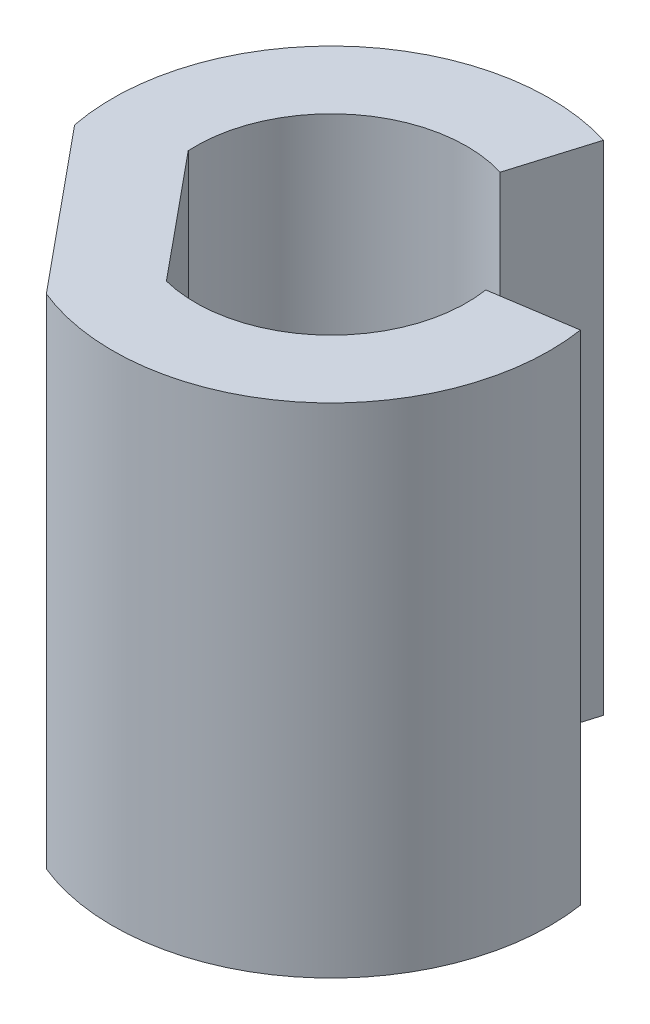
ISO-10303-21;
HEADER;
FILE_DESCRIPTION(('STEP AP214'),'2;1');
FILE_NAME('part.step','',(''),(''),'','','');
FILE_SCHEMA(('AUTOMOTIVE_DESIGN { 1 0 10303 214 1 1 1 1 }'));
ENDSEC;
DATA;
#1=APPLICATION_CONTEXT('core data for automotive mechanical design processes');
#2=APPLICATION_PROTOCOL_DEFINITION('international standard','automotive_design',2000,#1);
#3=PRODUCT_CONTEXT('',#1,'mechanical');
#4=PRODUCT('Part','Part','',(#3));
#5=PRODUCT_RELATED_PRODUCT_CATEGORY('part','',(#4));
#6=PRODUCT_DEFINITION_FORMATION('','',#4);
#7=PRODUCT_DEFINITION_CONTEXT('part definition',#1,'design');
#8=PRODUCT_DEFINITION('design','',#6,#7);
#9=PRODUCT_DEFINITION_SHAPE('','',#8);
#10=(LENGTH_UNIT() NAMED_UNIT(*) SI_UNIT(.MILLI.,.METRE.));
#11=(NAMED_UNIT(*) PLANE_ANGLE_UNIT() SI_UNIT($,.RADIAN.));
#12=(NAMED_UNIT(*) SI_UNIT($,.STERADIAN.) SOLID_ANGLE_UNIT());
#13=UNCERTAINTY_MEASURE_WITH_UNIT(LENGTH_MEASURE(1.E-05),#10,'distance_accuracy_value','');
#14=(GEOMETRIC_REPRESENTATION_CONTEXT(3) GLOBAL_UNCERTAINTY_ASSIGNED_CONTEXT((#13)) GLOBAL_UNIT_ASSIGNED_CONTEXT((#10,
#11,#12)) REPRESENTATION_CONTEXT('',''));
#15=CARTESIAN_POINT('',(0.,0.,0.));
#16=DIRECTION('',(0.,0.,1.));
#17=DIRECTION('',(1.,0.,0.));
#18=AXIS2_PLACEMENT_3D('',#15,#16,#17);
#19=CARTESIAN_POINT('',(0.,9.,0.));
#20=DIRECTION('',(0.,-1.,0.));
#21=DIRECTION('',(0.,0.,-1.));
#22=AXIS2_PLACEMENT_3D('',#19,#20,#21);
#23=CYLINDRICAL_SURFACE('',#22,2.45);
#24=CARTESIAN_POINT('',(0.,0.,0.));
#25=DIRECTION('',(0.,-1.,0.));
#26=DIRECTION('',(0.,0.,1.));
#27=AXIS2_PLACEMENT_3D('',#24,#25,#26);
#28=CIRCLE('',#27,2.45);
#29=CARTESIAN_POINT('',(2.42155894628891,0.,-0.37222610017051));
#30=VERTEX_POINT('',#29);
#31=CARTESIAN_POINT('',(-0.602474399543159,0.,2.37476832509934));
#32=VERTEX_POINT('',#31);
#33=EDGE_CURVE('E131',#30,#32,#28,.T.);
#34=ORIENTED_EDGE('',*,*,#33,.T.);
#35=DIRECTION('',(0.,-1.,0.));
#36=VECTOR('',#35,1.);
#37=CARTESIAN_POINT('',(-0.602474399543159,9.,2.37476832509934));
#38=LINE('',#37,#36);
#39=CARTESIAN_POINT('',(-0.602474399543159,9.,2.37476832509934));
#40=VERTEX_POINT('',#39);
#41=EDGE_CURVE('E11',#40,#32,#38,.T.);
#42=ORIENTED_EDGE('',*,*,#41,.F.);
#43=CARTESIAN_POINT('',(0.,9.,0.));
#44=DIRECTION('',(0.,-1.,0.));
#45=DIRECTION('',(0.,0.,1.));
#46=AXIS2_PLACEMENT_3D('',#43,#44,#45);
#47=CIRCLE('',#46,2.45);
#48=CARTESIAN_POINT('',(2.42155894628891,9.,-0.37222610017051));
#49=VERTEX_POINT('',#48);
#50=EDGE_CURVE('E145',#49,#40,#47,.T.);
#51=ORIENTED_EDGE('',*,*,#50,.F.);
#52=DIRECTION('',(0.,-1.,0.));
#53=VECTOR('',#52,1.);
#54=CARTESIAN_POINT('',(2.42155894628891,9.,-0.37222610017051));
#55=LINE('',#54,#53);
#56=EDGE_CURVE('E127',#49,#30,#55,.T.);
#57=ORIENTED_EDGE('',*,*,#56,.T.);
#58=EDGE_LOOP('',(#34,#42,#51,#57));
#59=FACE_BOUND('',#58,.T.);
#60=ADVANCED_FACE('F35',(#59),#23,.F.);
#61=CARTESIAN_POINT('',(-0.602474399543159,9.,2.37476832509934));
#62=DIRECTION('',(-0.771879330020003,0.,0.63576906175739));
#63=DIRECTION('',(0.63576906175739,0.,0.771879330020003));
#64=AXIS2_PLACEMENT_3D('',#61,#62,#63);
#65=PLANE('',#64);
#66=DIRECTION('',(-0.63576906175739,0.,-0.771879330020003));
#67=VECTOR('',#66,1.);
#68=CARTESIAN_POINT('',(-0.602474399543159,0.,2.37476832509934));
#69=LINE('',#68,#67);
#70=CARTESIAN_POINT('',(-2.44620467863959,0.,0.136318268041329));
#71=VERTEX_POINT('',#70);
#72=EDGE_CURVE('E134',#32,#71,#69,.T.);
#73=ORIENTED_EDGE('',*,*,#72,.T.);
#74=DIRECTION('',(0.,-1.,0.));
#75=VECTOR('',#74,1.);
#76=CARTESIAN_POINT('',(-2.44620467863959,9.,0.136318268041329));
#77=LINE('',#76,#75);
#78=CARTESIAN_POINT('',(-2.44620467863959,9.,0.136318268041329));
#79=VERTEX_POINT('',#78);
#80=EDGE_CURVE('E43',#79,#71,#77,.T.);
#81=ORIENTED_EDGE('',*,*,#80,.F.);
#82=DIRECTION('',(-0.63576906175739,0.,-0.771879330020003));
#83=VECTOR('',#82,1.);
#84=CARTESIAN_POINT('',(-0.602474399543159,9.,2.37476832509934));
#85=LINE('',#84,#83);
#86=EDGE_CURVE('E94',#40,#79,#85,.T.);
#87=ORIENTED_EDGE('',*,*,#86,.F.);
#88=ORIENTED_EDGE('',*,*,#41,.T.);
#89=EDGE_LOOP('',(#73,#81,#87,#88));
#90=FACE_BOUND('',#89,.T.);
#91=ADVANCED_FACE('F180',(#90),#65,.F.);
#92=CARTESIAN_POINT('',(0.,9.,0.));
#93=DIRECTION('',(0.,-1.,0.));
#94=DIRECTION('',(0.,0.,-1.));
#95=AXIS2_PLACEMENT_3D('',#92,#93,#94);
#96=CYLINDRICAL_SURFACE('',#95,2.45);
#97=CARTESIAN_POINT('',(0.,0.,0.));
#98=DIRECTION('',(0.,-1.,0.));
#99=DIRECTION('',(0.,0.,-1.));
#100=AXIS2_PLACEMENT_3D('',#97,#98,#99);
#101=CIRCLE('',#100,2.45);
#102=CARTESIAN_POINT('',(0.708554004235491,0.,-2.34530407902298));
#103=VERTEX_POINT('',#102);
#104=EDGE_CURVE('E136',#71,#103,#101,.T.);
#105=ORIENTED_EDGE('',*,*,#104,.T.);
#106=DIRECTION('',(0.,-1.,0.));
#107=VECTOR('',#106,1.);
#108=CARTESIAN_POINT('',(0.708554004235491,9.,-2.34530407902298));
#109=LINE('',#108,#107);
#110=CARTESIAN_POINT('',(0.708554004235491,9.,-2.34530407902298));
#111=VERTEX_POINT('',#110);
#112=EDGE_CURVE('E152',#111,#103,#109,.T.);
#113=ORIENTED_EDGE('',*,*,#112,.F.);
#114=CARTESIAN_POINT('',(0.,9.,0.));
#115=DIRECTION('',(0.,-1.,0.));
#116=DIRECTION('',(0.,0.,-1.));
#117=AXIS2_PLACEMENT_3D('',#114,#115,#116);
#118=CIRCLE('',#117,2.45);
#119=EDGE_CURVE('E160',#79,#111,#118,.T.);
#120=ORIENTED_EDGE('',*,*,#119,.F.);
#121=ORIENTED_EDGE('',*,*,#80,.T.);
#122=EDGE_LOOP('',(#105,#113,#120,#121));
#123=FACE_BOUND('',#122,.T.);
#124=ADVANCED_FACE('F158',(#123),#96,.F.);
#125=CARTESIAN_POINT('',(1.14236257825722,9.,-3.78120453556767));
#126=DIRECTION('',(-0.95726697102979,0.,-0.289205716014486));
#127=DIRECTION('',(-0.289205716014486,0.,0.95726697102979));
#128=AXIS2_PLACEMENT_3D('',#125,#126,#127);
#129=PLANE('',#128);
#130=DIRECTION('',(0.289205716014486,0.,-0.95726697102979));
#131=VECTOR('',#130,1.);
#132=CARTESIAN_POINT('',(1.14236257825722,0.,-3.78120453556767));
#133=LINE('',#132,#131);
#134=CARTESIAN_POINT('',(1.14236257825722,0.,-3.78120453556767));
#135=VERTEX_POINT('',#134);
#136=EDGE_CURVE('E138',#103,#135,#133,.T.);
#137=ORIENTED_EDGE('',*,*,#136,.T.);
#138=DIRECTION('',(0.,-1.,0.));
#139=VECTOR('',#138,1.);
#140=CARTESIAN_POINT('',(1.14236257825722,9.,-3.78120453556767));
#141=LINE('',#140,#139);
#142=CARTESIAN_POINT('',(1.14236257825722,9.,-3.78120453556767));
#143=VERTEX_POINT('',#142);
#144=EDGE_CURVE('E149',#143,#135,#141,.T.);
#145=ORIENTED_EDGE('',*,*,#144,.F.);
#146=DIRECTION('',(0.289205716014486,0.,-0.95726697102979));
#147=VECTOR('',#146,1.);
#148=CARTESIAN_POINT('',(1.14236257825722,9.,-3.78120453556767));
#149=LINE('',#148,#147);
#150=EDGE_CURVE('E172',#111,#143,#149,.T.);
#151=ORIENTED_EDGE('',*,*,#150,.F.);
#152=ORIENTED_EDGE('',*,*,#112,.T.);
#153=EDGE_LOOP('',(#137,#145,#151,#152));
#154=FACE_BOUND('',#153,.T.);
#155=ADVANCED_FACE('F168',(#154),#129,.F.);
#156=CARTESIAN_POINT('',(0.,9.,0.));
#157=DIRECTION('',(0.,-1.,0.));
#158=DIRECTION('',(0.,0.,-1.));
#159=AXIS2_PLACEMENT_3D('',#156,#157,#158);
#160=CYLINDRICAL_SURFACE('',#159,3.95);
#161=CARTESIAN_POINT('',(0.,0.,0.));
#162=DIRECTION('',(0.,1.,0.));
#163=DIRECTION('',(0.,0.,-1.));
#164=AXIS2_PLACEMENT_3D('',#161,#162,#163);
#165=CIRCLE('',#164,3.95);
#166=CARTESIAN_POINT('',(-3.87631743842231,0.,0.759383379185442));
#167=VERTEX_POINT('',#166);
#168=EDGE_CURVE('E140',#135,#167,#165,.T.);
#169=ORIENTED_EDGE('',*,*,#168,.T.);
#170=DIRECTION('',(0.,-1.,0.));
#171=VECTOR('',#170,1.);
#172=CARTESIAN_POINT('',(-3.87631743842231,9.,0.759383379185442));
#173=LINE('',#172,#171);
#174=CARTESIAN_POINT('',(-3.87631743842231,9.,0.759383379185442));
#175=VERTEX_POINT('',#174);
#176=EDGE_CURVE('E122',#175,#167,#173,.T.);
#177=ORIENTED_EDGE('',*,*,#176,.F.);
#178=CARTESIAN_POINT('',(0.,9.,0.));
#179=DIRECTION('',(0.,1.,0.));
#180=DIRECTION('',(0.,0.,-1.));
#181=AXIS2_PLACEMENT_3D('',#178,#179,#180);
#182=CIRCLE('',#181,3.95);
#183=EDGE_CURVE('E113',#143,#175,#182,.T.);
#184=ORIENTED_EDGE('',*,*,#183,.F.);
#185=ORIENTED_EDGE('',*,*,#144,.T.);
#186=EDGE_LOOP('',(#169,#177,#184,#185));
#187=FACE_BOUND('',#186,.T.);
#188=ADVANCED_FACE('F171',(#187),#160,.T.);
#189=CARTESIAN_POINT('',(-1.48799962982044,9.,3.6590103992274));
#190=DIRECTION('',(0.771879330020003,0.,-0.63576906175739));
#191=DIRECTION('',(-0.63576906175739,0.,-0.771879330020003));
#192=AXIS2_PLACEMENT_3D('',#189,#190,#191);
#193=PLANE('',#192);
#194=DIRECTION('',(0.63576906175739,0.,0.771879330020003));
#195=VECTOR('',#194,1.);
#196=CARTESIAN_POINT('',(-1.48799962982044,0.,3.6590103992274));
#197=LINE('',#196,#195);
#198=CARTESIAN_POINT('',(-1.48799962982044,0.,3.6590103992274));
#199=VERTEX_POINT('',#198);
#200=EDGE_CURVE('E121',#167,#199,#197,.T.);
#201=ORIENTED_EDGE('',*,*,#200,.T.);
#202=DIRECTION('',(0.,-1.,0.));
#203=VECTOR('',#202,1.);
#204=CARTESIAN_POINT('',(-1.48799962982044,9.,3.6590103992274));
#205=LINE('',#204,#203);
#206=CARTESIAN_POINT('',(-1.48799962982044,9.,3.6590103992274));
#207=VERTEX_POINT('',#206);
#208=EDGE_CURVE('E118',#207,#199,#205,.T.);
#209=ORIENTED_EDGE('',*,*,#208,.F.);
#210=DIRECTION('',(0.63576906175739,0.,0.771879330020003));
#211=VECTOR('',#210,1.);
#212=CARTESIAN_POINT('',(-1.48799962982044,9.,3.6590103992274));
#213=LINE('',#212,#211);
#214=EDGE_CURVE('E107',#175,#207,#213,.T.);
#215=ORIENTED_EDGE('',*,*,#214,.F.);
#216=ORIENTED_EDGE('',*,*,#176,.T.);
#217=EDGE_LOOP('',(#201,#209,#215,#216));
#218=FACE_BOUND('',#217,.T.);
#219=ADVANCED_FACE('F119',(#218),#193,.F.);
#220=CARTESIAN_POINT('',(0.,9.,0.));
#221=DIRECTION('',(0.,-1.,0.));
#222=DIRECTION('',(0.,0.,-1.));
#223=AXIS2_PLACEMENT_3D('',#220,#221,#222);
#224=CYLINDRICAL_SURFACE('',#223,3.95);
#225=CARTESIAN_POINT('',(0.,0.,0.));
#226=DIRECTION('',(0.,1.,0.));
#227=DIRECTION('',(0.,0.,1.));
#228=AXIS2_PLACEMENT_3D('',#225,#226,#227);
#229=CIRCLE('',#228,3.95);
#230=CARTESIAN_POINT('',(3.90414605626171,0.,-0.600119630887148));
#231=VERTEX_POINT('',#230);
#232=EDGE_CURVE('E80',#199,#231,#229,.T.);
#233=ORIENTED_EDGE('',*,*,#232,.T.);
#234=DIRECTION('',(0.,-1.,0.));
#235=VECTOR('',#234,1.);
#236=CARTESIAN_POINT('',(3.90414605626171,9.,-0.600119630887148));
#237=LINE('',#236,#235);
#238=CARTESIAN_POINT('',(3.90414605626171,9.,-0.600119630887148));
#239=VERTEX_POINT('',#238);
#240=EDGE_CURVE('E123',#239,#231,#237,.T.);
#241=ORIENTED_EDGE('',*,*,#240,.F.);
#242=CARTESIAN_POINT('',(0.,9.,0.));
#243=DIRECTION('',(0.,1.,0.));
#244=DIRECTION('',(0.,0.,1.));
#245=AXIS2_PLACEMENT_3D('',#242,#243,#244);
#246=CIRCLE('',#245,3.95);
#247=EDGE_CURVE('E111',#207,#239,#246,.T.);
#248=ORIENTED_EDGE('',*,*,#247,.F.);
#249=ORIENTED_EDGE('',*,*,#208,.T.);
#250=EDGE_LOOP('',(#233,#241,#248,#249));
#251=FACE_BOUND('',#250,.T.);
#252=ADVANCED_FACE('F125',(#251),#224,.T.);
#253=CARTESIAN_POINT('',(2.42155894628891,9.,-0.37222610017051));
#254=DIRECTION('',(0.151929020477759,0.,0.988391406648535));
#255=DIRECTION('',(0.988391406648535,0.,-0.151929020477759));
#256=AXIS2_PLACEMENT_3D('',#253,#254,#255);
#257=PLANE('',#256);
#258=DIRECTION('',(-0.988391406648534,0.,0.151929020477758));
#259=VECTOR('',#258,1.);
#260=CARTESIAN_POINT('',(2.42155894628891,0.,-0.37222610017051));
#261=LINE('',#260,#259);
#262=EDGE_CURVE('E86',#231,#30,#261,.T.);
#263=ORIENTED_EDGE('',*,*,#262,.T.);
#264=ORIENTED_EDGE('',*,*,#56,.F.);
#265=DIRECTION('',(-0.988391406648534,0.,0.151929020477758));
#266=VECTOR('',#265,1.);
#267=CARTESIAN_POINT('',(2.42155894628891,9.,-0.37222610017051));
#268=LINE('',#267,#266);
#269=EDGE_CURVE('E51',#239,#49,#268,.T.);
#270=ORIENTED_EDGE('',*,*,#269,.F.);
#271=ORIENTED_EDGE('',*,*,#240,.T.);
#272=EDGE_LOOP('',(#263,#264,#270,#271));
#273=FACE_BOUND('',#272,.T.);
#274=ADVANCED_FACE('F196',(#273),#257,.F.);
#275=CARTESIAN_POINT('',(0.,9.,0.));
#276=DIRECTION('',(0.,1.,0.));
#277=DIRECTION('',(0.,0.,1.));
#278=AXIS2_PLACEMENT_3D('',#275,#276,#277);
#279=PLANE('',#278);
#280=ORIENTED_EDGE('',*,*,#50,.T.);
#281=ORIENTED_EDGE('',*,*,#86,.T.);
#282=ORIENTED_EDGE('',*,*,#119,.T.);
#283=ORIENTED_EDGE('',*,*,#150,.T.);
#284=ORIENTED_EDGE('',*,*,#183,.T.);
#285=ORIENTED_EDGE('',*,*,#214,.T.);
#286=ORIENTED_EDGE('',*,*,#247,.T.);
#287=ORIENTED_EDGE('',*,*,#269,.T.);
#288=EDGE_LOOP('',(#280,#281,#282,#283,#284,#285,#286,#287));
#289=FACE_BOUND('',#288,.T.);
#290=ADVANCED_FACE('F109',(#289),#279,.T.);
#291=CARTESIAN_POINT('',(0.,0.,0.));
#292=DIRECTION('',(0.,1.,0.));
#293=DIRECTION('',(0.,0.,1.));
#294=AXIS2_PLACEMENT_3D('',#291,#292,#293);
#295=PLANE('',#294);
#296=ORIENTED_EDGE('',*,*,#33,.F.);
#297=ORIENTED_EDGE('',*,*,#262,.F.);
#298=ORIENTED_EDGE('',*,*,#232,.F.);
#299=ORIENTED_EDGE('',*,*,#200,.F.);
#300=ORIENTED_EDGE('',*,*,#168,.F.);
#301=ORIENTED_EDGE('',*,*,#136,.F.);
#302=ORIENTED_EDGE('',*,*,#104,.F.);
#303=ORIENTED_EDGE('',*,*,#72,.F.);
#304=EDGE_LOOP('',(#296,#297,#298,#299,#300,#301,#302,#303));
#305=FACE_BOUND('',#304,.T.);
#306=ADVANCED_FACE('F164',(#305),#295,.F.);
#307=CLOSED_SHELL('',(#60,#91,#124,#155,#188,#219,#252,#274,#290,#306));
#308=MANIFOLD_SOLID_BREP('B2',#307);
#309=ADVANCED_BREP_SHAPE_REPRESENTATION('',(#18,#308),#14);
#310=SHAPE_DEFINITION_REPRESENTATION(#9,#309);
ENDSEC;
END-ISO-10303-21;
